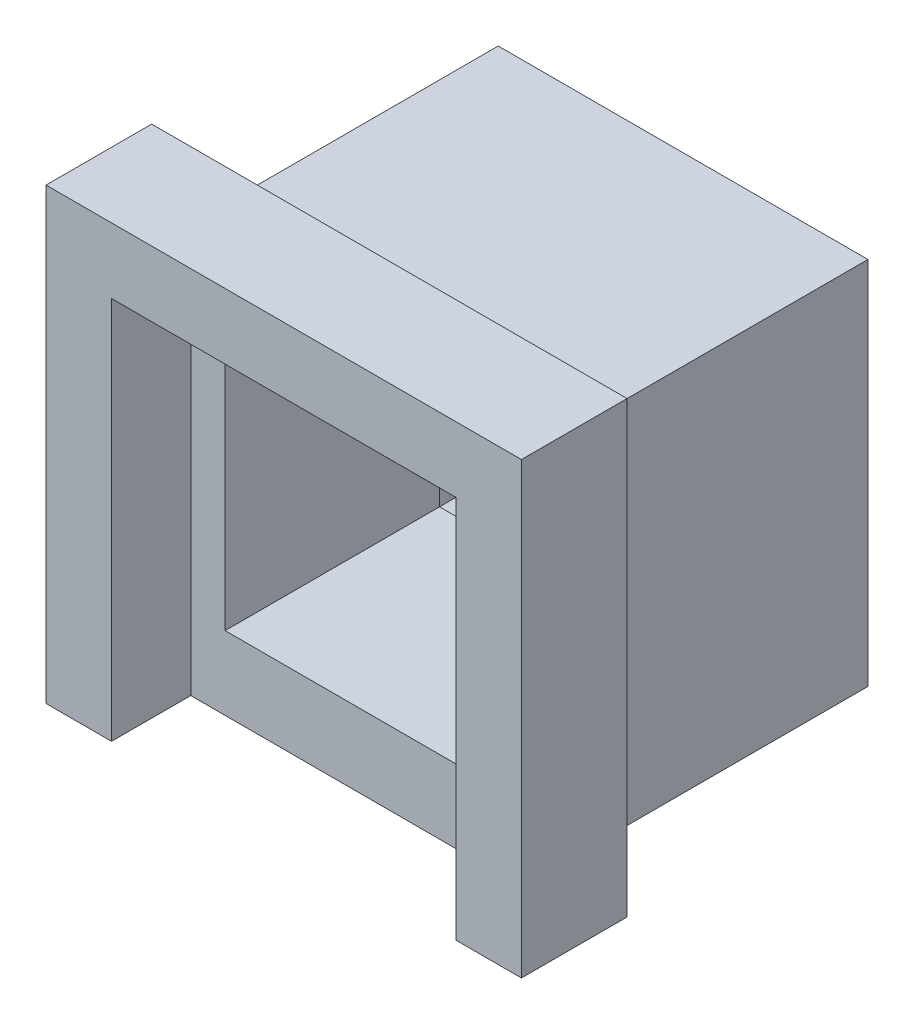
ISO-10303-21;
HEADER;
FILE_DESCRIPTION(('STEP AP214'),'2;1');
FILE_NAME('part.step','',(''),(''),'','','');
FILE_SCHEMA(('AUTOMOTIVE_DESIGN { 1 0 10303 214 1 1 1 1 }'));
ENDSEC;
DATA;
#1=APPLICATION_CONTEXT('core data for automotive mechanical design processes');
#2=APPLICATION_PROTOCOL_DEFINITION('international standard','automotive_design',2000,#1);
#3=PRODUCT_CONTEXT('',#1,'mechanical');
#4=PRODUCT('Part','Part','',(#3));
#5=PRODUCT_RELATED_PRODUCT_CATEGORY('part','',(#4));
#6=PRODUCT_DEFINITION_FORMATION('','',#4);
#7=PRODUCT_DEFINITION_CONTEXT('part definition',#1,'design');
#8=PRODUCT_DEFINITION('design','',#6,#7);
#9=PRODUCT_DEFINITION_SHAPE('','',#8);
#10=(LENGTH_UNIT() NAMED_UNIT(*) SI_UNIT(.MILLI.,.METRE.));
#11=(NAMED_UNIT(*) PLANE_ANGLE_UNIT() SI_UNIT($,.RADIAN.));
#12=(NAMED_UNIT(*) SI_UNIT($,.STERADIAN.) SOLID_ANGLE_UNIT());
#13=UNCERTAINTY_MEASURE_WITH_UNIT(LENGTH_MEASURE(1.E-05),#10,'distance_accuracy_value','');
#14=(GEOMETRIC_REPRESENTATION_CONTEXT(3) GLOBAL_UNCERTAINTY_ASSIGNED_CONTEXT((#13)) GLOBAL_UNIT_ASSIGNED_CONTEXT((#10,
#11,#12)) REPRESENTATION_CONTEXT('',''));
#15=CARTESIAN_POINT('',(0.,0.,0.));
#16=DIRECTION('',(0.,0.,1.));
#17=DIRECTION('',(1.,0.,0.));
#18=AXIS2_PLACEMENT_3D('',#15,#16,#17);
#19=CARTESIAN_POINT('',(-1.305,-1.305,3.78));
#20=DIRECTION('',(1.,0.,0.));
#21=DIRECTION('',(0.,0.,-1.));
#22=AXIS2_PLACEMENT_3D('',#19,#20,#21);
#23=PLANE('',#22);
#24=DIRECTION('',(0.,0.,-1.));
#25=VECTOR('',#24,1.);
#26=CARTESIAN_POINT('',(-1.305,1.305,3.78));
#27=LINE('',#26,#25);
#28=CARTESIAN_POINT('',(-1.305,1.305,3.03));
#29=VERTEX_POINT('',#28);
#30=CARTESIAN_POINT('',(-1.305,1.305,1.));
#31=VERTEX_POINT('',#30);
#32=EDGE_CURVE('E297',#29,#31,#27,.T.);
#33=ORIENTED_EDGE('',*,*,#32,.F.);
#34=DIRECTION('',(0.,-1.,0.));
#35=VECTOR('',#34,1.);
#36=CARTESIAN_POINT('',(-1.305,-1.305,3.03));
#37=LINE('',#36,#35);
#38=CARTESIAN_POINT('',(-1.305,-1.305,3.03));
#39=VERTEX_POINT('',#38);
#40=EDGE_CURVE('E49',#29,#39,#37,.T.);
#41=ORIENTED_EDGE('',*,*,#40,.T.);
#42=DIRECTION('',(0.,0.,-1.));
#43=VECTOR('',#42,1.);
#44=CARTESIAN_POINT('',(-1.305,-1.305,3.78));
#45=LINE('',#44,#43);
#46=CARTESIAN_POINT('',(-1.305,-1.305,1.));
#47=VERTEX_POINT('',#46);
#48=EDGE_CURVE('E303',#39,#47,#45,.T.);
#49=ORIENTED_EDGE('',*,*,#48,.T.);
#50=DIRECTION('',(0.,-1.,0.));
#51=VECTOR('',#50,1.);
#52=CARTESIAN_POINT('',(-1.305,-1.305,1.));
#53=LINE('',#52,#51);
#54=EDGE_CURVE('E260',#31,#47,#53,.T.);
#55=ORIENTED_EDGE('',*,*,#54,.F.);
#56=EDGE_LOOP('',(#33,#41,#49,#55));
#57=FACE_BOUND('',#56,.T.);
#58=ADVANCED_FACE('F34',(#57),#23,.T.);
#59=CARTESIAN_POINT('',(1.305,-1.305,3.78));
#60=DIRECTION('',(0.,1.,0.));
#61=DIRECTION('',(-1.,0.,0.));
#62=AXIS2_PLACEMENT_3D('',#59,#60,#61);
#63=PLANE('',#62);
#64=ORIENTED_EDGE('',*,*,#48,.F.);
#65=DIRECTION('',(1.,0.,0.));
#66=VECTOR('',#65,1.);
#67=CARTESIAN_POINT('',(1.305,-1.305,3.03));
#68=LINE('',#67,#66);
#69=CARTESIAN_POINT('',(1.305,-1.305,3.03));
#70=VERTEX_POINT('',#69);
#71=EDGE_CURVE('E204',#39,#70,#68,.T.);
#72=ORIENTED_EDGE('',*,*,#71,.T.);
#73=DIRECTION('',(0.,0.,-1.));
#74=VECTOR('',#73,1.);
#75=CARTESIAN_POINT('',(1.305,-1.305,3.78));
#76=LINE('',#75,#74);
#77=CARTESIAN_POINT('',(1.305,-1.305,1.));
#78=VERTEX_POINT('',#77);
#79=EDGE_CURVE('E301',#70,#78,#76,.T.);
#80=ORIENTED_EDGE('',*,*,#79,.T.);
#81=DIRECTION('',(1.,0.,0.));
#82=VECTOR('',#81,1.);
#83=CARTESIAN_POINT('',(-1.305,-1.305,1.));
#84=LINE('',#83,#82);
#85=EDGE_CURVE('E263',#47,#78,#84,.T.);
#86=ORIENTED_EDGE('',*,*,#85,.F.);
#87=EDGE_LOOP('',(#64,#72,#80,#86));
#88=FACE_BOUND('',#87,.T.);
#89=ADVANCED_FACE('F360',(#88),#63,.T.);
#90=CARTESIAN_POINT('',(1.305,-1.305,3.78));
#91=DIRECTION('',(-1.,0.,0.));
#92=DIRECTION('',(0.,0.,1.));
#93=AXIS2_PLACEMENT_3D('',#90,#91,#92);
#94=PLANE('',#93);
#95=ORIENTED_EDGE('',*,*,#79,.F.);
#96=DIRECTION('',(0.,1.,0.));
#97=VECTOR('',#96,1.);
#98=CARTESIAN_POINT('',(1.305,-1.305,3.03));
#99=LINE('',#98,#97);
#100=CARTESIAN_POINT('',(1.305,1.305,3.03));
#101=VERTEX_POINT('',#100);
#102=EDGE_CURVE('E201',#70,#101,#99,.T.);
#103=ORIENTED_EDGE('',*,*,#102,.T.);
#104=DIRECTION('',(0.,0.,-1.));
#105=VECTOR('',#104,1.);
#106=CARTESIAN_POINT('',(1.305,1.305,3.78));
#107=LINE('',#106,#105);
#108=CARTESIAN_POINT('',(1.305,1.305,1.));
#109=VERTEX_POINT('',#108);
#110=EDGE_CURVE('E299',#101,#109,#107,.T.);
#111=ORIENTED_EDGE('',*,*,#110,.T.);
#112=DIRECTION('',(0.,1.,0.));
#113=VECTOR('',#112,1.);
#114=CARTESIAN_POINT('',(1.305,-1.305,1.));
#115=LINE('',#114,#113);
#116=EDGE_CURVE('E248',#78,#109,#115,.T.);
#117=ORIENTED_EDGE('',*,*,#116,.F.);
#118=EDGE_LOOP('',(#95,#103,#111,#117));
#119=FACE_BOUND('',#118,.T.);
#120=ADVANCED_FACE('F366',(#119),#94,.T.);
#121=CARTESIAN_POINT('',(1.305,1.305,3.78));
#122=DIRECTION('',(0.,-1.,0.));
#123=DIRECTION('',(1.,0.,0.));
#124=AXIS2_PLACEMENT_3D('',#121,#122,#123);
#125=PLANE('',#124);
#126=ORIENTED_EDGE('',*,*,#110,.F.);
#127=DIRECTION('',(-1.,0.,0.));
#128=VECTOR('',#127,1.);
#129=CARTESIAN_POINT('',(1.305,1.305,3.03));
#130=LINE('',#129,#128);
#131=EDGE_CURVE('E198',#101,#29,#130,.T.);
#132=ORIENTED_EDGE('',*,*,#131,.T.);
#133=ORIENTED_EDGE('',*,*,#32,.T.);
#134=DIRECTION('',(-1.,0.,0.));
#135=VECTOR('',#134,1.);
#136=CARTESIAN_POINT('',(-1.305,1.305,1.));
#137=LINE('',#136,#135);
#138=EDGE_CURVE('E257',#109,#31,#137,.T.);
#139=ORIENTED_EDGE('',*,*,#138,.F.);
#140=EDGE_LOOP('',(#126,#132,#133,#139));
#141=FACE_BOUND('',#140,.T.);
#142=ADVANCED_FACE('F392',(#141),#125,.T.);
#143=CARTESIAN_POINT('',(-1.75,-1.75,3.78));
#144=DIRECTION('',(1.,0.,0.));
#145=DIRECTION('',(0.,0.,-1.));
#146=AXIS2_PLACEMENT_3D('',#143,#144,#145);
#147=PLANE('',#146);
#148=DIRECTION('',(0.,-1.,0.));
#149=VECTOR('',#148,1.);
#150=CARTESIAN_POINT('',(-1.75,1.75,2.78));
#151=LINE('',#150,#149);
#152=CARTESIAN_POINT('',(-1.75,1.75,2.78));
#153=VERTEX_POINT('',#152);
#154=CARTESIAN_POINT('',(-1.75,-1.75,2.78));
#155=VERTEX_POINT('',#154);
#156=EDGE_CURVE('E214',#153,#155,#151,.T.);
#157=ORIENTED_EDGE('',*,*,#156,.F.);
#158=DIRECTION('',(0.,0.,-1.));
#159=VECTOR('',#158,1.);
#160=CARTESIAN_POINT('',(-1.75,1.75,3.78));
#161=LINE('',#160,#159);
#162=CARTESIAN_POINT('',(-1.75,1.75,0.));
#163=VERTEX_POINT('',#162);
#164=EDGE_CURVE('E317',#153,#163,#161,.T.);
#165=ORIENTED_EDGE('',*,*,#164,.T.);
#166=DIRECTION('',(0.,-1.,0.));
#167=VECTOR('',#166,1.);
#168=CARTESIAN_POINT('',(-1.75,-1.75,0.));
#169=LINE('',#168,#167);
#170=CARTESIAN_POINT('',(-1.75,-1.75,0.));
#171=VERTEX_POINT('',#170);
#172=EDGE_CURVE('E305',#163,#171,#169,.T.);
#173=ORIENTED_EDGE('',*,*,#172,.T.);
#174=DIRECTION('',(0.,0.,-1.));
#175=VECTOR('',#174,1.);
#176=CARTESIAN_POINT('',(-1.75,-1.75,3.78));
#177=LINE('',#176,#175);
#178=EDGE_CURVE('E323',#155,#171,#177,.T.);
#179=ORIENTED_EDGE('',*,*,#178,.F.);
#180=EDGE_LOOP('',(#157,#165,#173,#179));
#181=FACE_BOUND('',#180,.T.);
#182=ADVANCED_FACE('F36',(#181),#147,.F.);
#183=CARTESIAN_POINT('',(1.75,-1.75,3.78));
#184=DIRECTION('',(0.,1.,0.));
#185=DIRECTION('',(-1.,0.,0.));
#186=AXIS2_PLACEMENT_3D('',#183,#184,#185);
#187=PLANE('',#186);
#188=DIRECTION('',(1.,0.,0.));
#189=VECTOR('',#188,1.);
#190=CARTESIAN_POINT('',(-1.75,-1.75,2.78));
#191=LINE('',#190,#189);
#192=CARTESIAN_POINT('',(1.75,-1.75,2.78));
#193=VERTEX_POINT('',#192);
#194=EDGE_CURVE('E217',#155,#193,#191,.T.);
#195=ORIENTED_EDGE('',*,*,#194,.F.);
#196=ORIENTED_EDGE('',*,*,#178,.T.);
#197=DIRECTION('',(1.,0.,0.));
#198=VECTOR('',#197,1.);
#199=CARTESIAN_POINT('',(1.75,-1.75,0.));
#200=LINE('',#199,#198);
#201=CARTESIAN_POINT('',(1.75,-1.75,0.));
#202=VERTEX_POINT('',#201);
#203=EDGE_CURVE('E308',#171,#202,#200,.T.);
#204=ORIENTED_EDGE('',*,*,#203,.T.);
#205=DIRECTION('',(0.,0.,-1.));
#206=VECTOR('',#205,1.);
#207=CARTESIAN_POINT('',(1.75,-1.75,3.78));
#208=LINE('',#207,#206);
#209=EDGE_CURVE('E321',#193,#202,#208,.T.);
#210=ORIENTED_EDGE('',*,*,#209,.F.);
#211=EDGE_LOOP('',(#195,#196,#204,#210));
#212=FACE_BOUND('',#211,.T.);
#213=ADVANCED_FACE('F385',(#212),#187,.F.);
#214=CARTESIAN_POINT('',(1.75,-1.75,3.78));
#215=DIRECTION('',(-1.,0.,0.));
#216=DIRECTION('',(0.,0.,1.));
#217=AXIS2_PLACEMENT_3D('',#214,#215,#216);
#218=PLANE('',#217);
#219=DIRECTION('',(0.,1.,0.));
#220=VECTOR('',#219,1.);
#221=CARTESIAN_POINT('',(1.75,-1.75,2.78));
#222=LINE('',#221,#220);
#223=CARTESIAN_POINT('',(1.75,1.75,2.78));
#224=VERTEX_POINT('',#223);
#225=EDGE_CURVE('E208',#193,#224,#222,.T.);
#226=ORIENTED_EDGE('',*,*,#225,.F.);
#227=ORIENTED_EDGE('',*,*,#209,.T.);
#228=DIRECTION('',(0.,1.,0.));
#229=VECTOR('',#228,1.);
#230=CARTESIAN_POINT('',(1.75,-1.75,0.));
#231=LINE('',#230,#229);
#232=CARTESIAN_POINT('',(1.75,1.75,0.));
#233=VERTEX_POINT('',#232);
#234=EDGE_CURVE('E311',#202,#233,#231,.T.);
#235=ORIENTED_EDGE('',*,*,#234,.T.);
#236=DIRECTION('',(0.,0.,-1.));
#237=VECTOR('',#236,1.);
#238=CARTESIAN_POINT('',(1.75,1.75,3.78));
#239=LINE('',#238,#237);
#240=EDGE_CURVE('E319',#224,#233,#239,.T.);
#241=ORIENTED_EDGE('',*,*,#240,.F.);
#242=EDGE_LOOP('',(#226,#227,#235,#241));
#243=FACE_BOUND('',#242,.T.);
#244=ADVANCED_FACE('F382',(#243),#218,.F.);
#245=CARTESIAN_POINT('',(1.75,1.75,3.78));
#246=DIRECTION('',(0.,-1.,0.));
#247=DIRECTION('',(1.,0.,0.));
#248=AXIS2_PLACEMENT_3D('',#245,#246,#247);
#249=PLANE('',#248);
#250=DIRECTION('',(-1.,0.,0.));
#251=VECTOR('',#250,1.);
#252=CARTESIAN_POINT('',(1.75,1.75,2.78));
#253=LINE('',#252,#251);
#254=EDGE_CURVE('E211',#224,#153,#253,.T.);
#255=ORIENTED_EDGE('',*,*,#254,.F.);
#256=ORIENTED_EDGE('',*,*,#240,.T.);
#257=DIRECTION('',(-1.,0.,0.));
#258=VECTOR('',#257,1.);
#259=CARTESIAN_POINT('',(1.75,1.75,0.));
#260=LINE('',#259,#258);
#261=EDGE_CURVE('E314',#233,#163,#260,.T.);
#262=ORIENTED_EDGE('',*,*,#261,.T.);
#263=ORIENTED_EDGE('',*,*,#164,.F.);
#264=EDGE_LOOP('',(#255,#256,#262,#263));
#265=FACE_BOUND('',#264,.T.);
#266=ADVANCED_FACE('F378',(#265),#249,.F.);
#267=CARTESIAN_POINT('',(0.,0.,0.));
#268=DIRECTION('',(0.,0.,1.));
#269=DIRECTION('',(1.,0.,0.));
#270=AXIS2_PLACEMENT_3D('',#267,#268,#269);
#271=PLANE('',#270);
#272=ORIENTED_EDGE('',*,*,#172,.F.);
#273=ORIENTED_EDGE('',*,*,#261,.F.);
#274=ORIENTED_EDGE('',*,*,#234,.F.);
#275=ORIENTED_EDGE('',*,*,#203,.F.);
#276=EDGE_LOOP('',(#272,#273,#274,#275));
#277=FACE_BOUND('',#276,.T.);
#278=DIRECTION('',(0.,1.,0.));
#279=VECTOR('',#278,1.);
#280=CARTESIAN_POINT('',(1.55,-1.55,0.));
#281=LINE('',#280,#279);
#282=CARTESIAN_POINT('',(1.55,-1.55,0.));
#283=VERTEX_POINT('',#282);
#284=CARTESIAN_POINT('',(1.55,1.55,0.));
#285=VERTEX_POINT('',#284);
#286=EDGE_CURVE('E266',#283,#285,#281,.T.);
#287=ORIENTED_EDGE('',*,*,#286,.T.);
#288=DIRECTION('',(-1.,0.,0.));
#289=VECTOR('',#288,1.);
#290=CARTESIAN_POINT('',(-1.55,1.55,0.));
#291=LINE('',#290,#289);
#292=CARTESIAN_POINT('',(-1.55,1.55,0.));
#293=VERTEX_POINT('',#292);
#294=EDGE_CURVE('E280',#285,#293,#291,.T.);
#295=ORIENTED_EDGE('',*,*,#294,.T.);
#296=DIRECTION('',(0.,-1.,0.));
#297=VECTOR('',#296,1.);
#298=CARTESIAN_POINT('',(-1.55,-1.55,0.));
#299=LINE('',#298,#297);
#300=CARTESIAN_POINT('',(-1.55,-1.55,0.));
#301=VERTEX_POINT('',#300);
#302=EDGE_CURVE('E283',#293,#301,#299,.T.);
#303=ORIENTED_EDGE('',*,*,#302,.T.);
#304=DIRECTION('',(1.,0.,0.));
#305=VECTOR('',#304,1.);
#306=CARTESIAN_POINT('',(-1.55,-1.55,0.));
#307=LINE('',#306,#305);
#308=EDGE_CURVE('E271',#301,#283,#307,.T.);
#309=ORIENTED_EDGE('',*,*,#308,.T.);
#310=EDGE_LOOP('',(#287,#295,#303,#309));
#311=FACE_BOUND('',#310,.T.);
#312=ADVANCED_FACE('F375',(#277,#311),#271,.F.);
#313=CARTESIAN_POINT('',(0.,0.,3.78));
#314=DIRECTION('',(0.,0.,1.));
#315=DIRECTION('',(1.,0.,0.));
#316=AXIS2_PLACEMENT_3D('',#313,#314,#315);
#317=PLANE('',#316);
#318=DIRECTION('',(0.,-1.,0.));
#319=VECTOR('',#318,1.);
#320=CARTESIAN_POINT('',(-1.63,1.63,3.78));
#321=LINE('',#320,#319);
#322=CARTESIAN_POINT('',(-1.63,1.63,3.78));
#323=VERTEX_POINT('',#322);
#324=CARTESIAN_POINT('',(-1.63,-2.,3.78));
#325=VERTEX_POINT('',#324);
#326=EDGE_CURVE('E193',#323,#325,#321,.T.);
#327=ORIENTED_EDGE('',*,*,#326,.F.);
#328=DIRECTION('',(-1.,0.,0.));
#329=VECTOR('',#328,1.);
#330=CARTESIAN_POINT('',(-1.63,1.63,3.78));
#331=LINE('',#330,#329);
#332=CARTESIAN_POINT('',(1.63,1.63,3.78));
#333=VERTEX_POINT('',#332);
#334=EDGE_CURVE('E196',#333,#323,#331,.T.);
#335=ORIENTED_EDGE('',*,*,#334,.F.);
#336=DIRECTION('',(0.,1.,0.));
#337=VECTOR('',#336,1.);
#338=CARTESIAN_POINT('',(1.63,1.63,3.78));
#339=LINE('',#338,#337);
#340=CARTESIAN_POINT('',(1.63,-2.,3.78));
#341=VERTEX_POINT('',#340);
#342=EDGE_CURVE('E183',#341,#333,#339,.T.);
#343=ORIENTED_EDGE('',*,*,#342,.F.);
#344=DIRECTION('',(1.,0.,0.));
#345=VECTOR('',#344,1.);
#346=CARTESIAN_POINT('',(-2.25,-2.,3.78));
#347=LINE('',#346,#345);
#348=CARTESIAN_POINT('',(2.25,-2.,3.78));
#349=VERTEX_POINT('',#348);
#350=EDGE_CURVE('E237',#341,#349,#347,.T.);
#351=ORIENTED_EDGE('',*,*,#350,.T.);
#352=DIRECTION('',(0.,1.,0.));
#353=VECTOR('',#352,1.);
#354=CARTESIAN_POINT('',(2.25,-2.,3.78));
#355=LINE('',#354,#353);
#356=CARTESIAN_POINT('',(2.25,2.25,3.78));
#357=VERTEX_POINT('',#356);
#358=EDGE_CURVE('E241',#349,#357,#355,.T.);
#359=ORIENTED_EDGE('',*,*,#358,.T.);
#360=DIRECTION('',(-1.,0.,0.));
#361=VECTOR('',#360,1.);
#362=CARTESIAN_POINT('',(-2.25,2.25,3.78));
#363=LINE('',#362,#361);
#364=CARTESIAN_POINT('',(-2.25,2.25,3.78));
#365=VERTEX_POINT('',#364);
#366=EDGE_CURVE('E225',#357,#365,#363,.T.);
#367=ORIENTED_EDGE('',*,*,#366,.T.);
#368=DIRECTION('',(0.,-1.,0.));
#369=VECTOR('',#368,1.);
#370=CARTESIAN_POINT('',(-2.25,2.25,3.78));
#371=LINE('',#370,#369);
#372=CARTESIAN_POINT('',(-2.25,-2.,3.78));
#373=VERTEX_POINT('',#372);
#374=EDGE_CURVE('E220',#365,#373,#371,.T.);
#375=ORIENTED_EDGE('',*,*,#374,.T.);
#376=EDGE_CURVE('E238',#373,#325,#347,.T.);
#377=ORIENTED_EDGE('',*,*,#376,.T.);
#378=EDGE_LOOP('',(#327,#335,#343,#351,#359,#367,#375,#377));
#379=FACE_BOUND('',#378,.T.);
#380=ADVANCED_FACE('F329',(#379),#317,.T.);
#381=CARTESIAN_POINT('',(0.,0.,1.));
#382=DIRECTION('',(0.,0.,-1.));
#383=DIRECTION('',(-1.,0.,0.));
#384=AXIS2_PLACEMENT_3D('',#381,#382,#383);
#385=PLANE('',#384);
#386=DIRECTION('',(0.,1.,0.));
#387=VECTOR('',#386,1.);
#388=CARTESIAN_POINT('',(1.55,-1.55,1.));
#389=LINE('',#388,#387);
#390=CARTESIAN_POINT('',(1.55,-1.55,1.));
#391=VERTEX_POINT('',#390);
#392=CARTESIAN_POINT('',(1.55,1.55,1.));
#393=VERTEX_POINT('',#392);
#394=EDGE_CURVE('E267',#391,#393,#389,.T.);
#395=ORIENTED_EDGE('',*,*,#394,.F.);
#396=DIRECTION('',(1.,0.,0.));
#397=VECTOR('',#396,1.);
#398=CARTESIAN_POINT('',(-1.55,-1.55,1.));
#399=LINE('',#398,#397);
#400=CARTESIAN_POINT('',(-1.55,-1.55,1.));
#401=VERTEX_POINT('',#400);
#402=EDGE_CURVE('E275',#401,#391,#399,.T.);
#403=ORIENTED_EDGE('',*,*,#402,.F.);
#404=DIRECTION('',(0.,-1.,0.));
#405=VECTOR('',#404,1.);
#406=CARTESIAN_POINT('',(-1.55,-1.55,1.));
#407=LINE('',#406,#405);
#408=CARTESIAN_POINT('',(-1.55,1.55,1.));
#409=VERTEX_POINT('',#408);
#410=EDGE_CURVE('E273',#409,#401,#407,.T.);
#411=ORIENTED_EDGE('',*,*,#410,.F.);
#412=DIRECTION('',(-1.,0.,0.));
#413=VECTOR('',#412,1.);
#414=CARTESIAN_POINT('',(-1.55,1.55,1.));
#415=LINE('',#414,#413);
#416=EDGE_CURVE('E270',#393,#409,#415,.T.);
#417=ORIENTED_EDGE('',*,*,#416,.F.);
#418=EDGE_LOOP('',(#395,#403,#411,#417));
#419=FACE_BOUND('',#418,.T.);
#420=ORIENTED_EDGE('',*,*,#116,.T.);
#421=ORIENTED_EDGE('',*,*,#138,.T.);
#422=ORIENTED_EDGE('',*,*,#54,.T.);
#423=ORIENTED_EDGE('',*,*,#85,.T.);
#424=EDGE_LOOP('',(#420,#421,#422,#423));
#425=FACE_BOUND('',#424,.T.);
#426=ADVANCED_FACE('F374',(#419,#425),#385,.T.);
#427=CARTESIAN_POINT('',(1.55,-1.55,1.));
#428=DIRECTION('',(-1.,0.,0.));
#429=DIRECTION('',(0.,0.,1.));
#430=AXIS2_PLACEMENT_3D('',#427,#428,#429);
#431=PLANE('',#430);
#432=ORIENTED_EDGE('',*,*,#286,.F.);
#433=DIRECTION('',(0.,0.,-1.));
#434=VECTOR('',#433,1.);
#435=CARTESIAN_POINT('',(1.55,-1.55,1.));
#436=LINE('',#435,#434);
#437=EDGE_CURVE('E277',#391,#283,#436,.T.);
#438=ORIENTED_EDGE('',*,*,#437,.F.);
#439=ORIENTED_EDGE('',*,*,#394,.T.);
#440=DIRECTION('',(0.,0.,-1.));
#441=VECTOR('',#440,1.);
#442=CARTESIAN_POINT('',(1.55,1.55,1.));
#443=LINE('',#442,#441);
#444=EDGE_CURVE('E294',#393,#285,#443,.T.);
#445=ORIENTED_EDGE('',*,*,#444,.T.);
#446=EDGE_LOOP('',(#432,#438,#439,#445));
#447=FACE_BOUND('',#446,.T.);
#448=ADVANCED_FACE('F407',(#447),#431,.T.);
#449=CARTESIAN_POINT('',(-1.55,1.55,1.));
#450=DIRECTION('',(0.,-1.,0.));
#451=DIRECTION('',(0.,0.,-1.));
#452=AXIS2_PLACEMENT_3D('',#449,#450,#451);
#453=PLANE('',#452);
#454=ORIENTED_EDGE('',*,*,#294,.F.);
#455=ORIENTED_EDGE('',*,*,#444,.F.);
#456=ORIENTED_EDGE('',*,*,#416,.T.);
#457=DIRECTION('',(0.,0.,-1.));
#458=VECTOR('',#457,1.);
#459=CARTESIAN_POINT('',(-1.55,1.55,1.));
#460=LINE('',#459,#458);
#461=EDGE_CURVE('E292',#409,#293,#460,.T.);
#462=ORIENTED_EDGE('',*,*,#461,.T.);
#463=EDGE_LOOP('',(#454,#455,#456,#462));
#464=FACE_BOUND('',#463,.T.);
#465=ADVANCED_FACE('F418',(#464),#453,.T.);
#466=CARTESIAN_POINT('',(-1.55,-1.55,1.));
#467=DIRECTION('',(1.,0.,0.));
#468=DIRECTION('',(0.,0.,-1.));
#469=AXIS2_PLACEMENT_3D('',#466,#467,#468);
#470=PLANE('',#469);
#471=ORIENTED_EDGE('',*,*,#302,.F.);
#472=ORIENTED_EDGE('',*,*,#461,.F.);
#473=ORIENTED_EDGE('',*,*,#410,.T.);
#474=DIRECTION('',(0.,0.,-1.));
#475=VECTOR('',#474,1.);
#476=CARTESIAN_POINT('',(-1.55,-1.55,1.));
#477=LINE('',#476,#475);
#478=EDGE_CURVE('E290',#401,#301,#477,.T.);
#479=ORIENTED_EDGE('',*,*,#478,.T.);
#480=EDGE_LOOP('',(#471,#472,#473,#479));
#481=FACE_BOUND('',#480,.T.);
#482=ADVANCED_FACE('F422',(#481),#470,.T.);
#483=CARTESIAN_POINT('',(-1.55,-1.55,1.));
#484=DIRECTION('',(0.,1.,0.));
#485=DIRECTION('',(0.,0.,1.));
#486=AXIS2_PLACEMENT_3D('',#483,#484,#485);
#487=PLANE('',#486);
#488=ORIENTED_EDGE('',*,*,#308,.F.);
#489=ORIENTED_EDGE('',*,*,#478,.F.);
#490=ORIENTED_EDGE('',*,*,#402,.T.);
#491=ORIENTED_EDGE('',*,*,#437,.T.);
#492=EDGE_LOOP('',(#488,#489,#490,#491));
#493=FACE_BOUND('',#492,.T.);
#494=ADVANCED_FACE('F411',(#493),#487,.T.);
#495=CARTESIAN_POINT('',(-2.25,2.25,2.78));
#496=DIRECTION('',(-1.,0.,0.));
#497=DIRECTION('',(0.,0.,1.));
#498=AXIS2_PLACEMENT_3D('',#495,#496,#497);
#499=PLANE('',#498);
#500=ORIENTED_EDGE('',*,*,#374,.F.);
#501=DIRECTION('',(0.,0.,1.));
#502=VECTOR('',#501,1.);
#503=CARTESIAN_POINT('',(-2.25,2.25,2.78));
#504=LINE('',#503,#502);
#505=CARTESIAN_POINT('',(-2.25,2.25,2.78));
#506=VERTEX_POINT('',#505);
#507=EDGE_CURVE('E246',#506,#365,#504,.T.);
#508=ORIENTED_EDGE('',*,*,#507,.F.);
#509=DIRECTION('',(0.,-1.,0.));
#510=VECTOR('',#509,1.);
#511=CARTESIAN_POINT('',(-2.25,2.25,2.78));
#512=LINE('',#511,#510);
#513=CARTESIAN_POINT('',(-2.25,-2.,2.78));
#514=VERTEX_POINT('',#513);
#515=EDGE_CURVE('E221',#506,#514,#512,.T.);
#516=ORIENTED_EDGE('',*,*,#515,.T.);
#517=DIRECTION('',(0.,0.,1.));
#518=VECTOR('',#517,1.);
#519=CARTESIAN_POINT('',(-2.25,-2.,2.78));
#520=LINE('',#519,#518);
#521=EDGE_CURVE('E234',#514,#373,#520,.T.);
#522=ORIENTED_EDGE('',*,*,#521,.T.);
#523=EDGE_LOOP('',(#500,#508,#516,#522));
#524=FACE_BOUND('',#523,.T.);
#525=ADVANCED_FACE('F344',(#524),#499,.T.);
#526=CARTESIAN_POINT('',(-2.25,2.25,2.78));
#527=DIRECTION('',(0.,1.,0.));
#528=DIRECTION('',(-1.,0.,0.));
#529=AXIS2_PLACEMENT_3D('',#526,#527,#528);
#530=PLANE('',#529);
#531=ORIENTED_EDGE('',*,*,#366,.F.);
#532=DIRECTION('',(0.,0.,1.));
#533=VECTOR('',#532,1.);
#534=CARTESIAN_POINT('',(2.25,2.25,2.78));
#535=LINE('',#534,#533);
#536=CARTESIAN_POINT('',(2.25,2.25,2.78));
#537=VERTEX_POINT('',#536);
#538=EDGE_CURVE('E249',#537,#357,#535,.T.);
#539=ORIENTED_EDGE('',*,*,#538,.F.);
#540=DIRECTION('',(-1.,0.,0.));
#541=VECTOR('',#540,1.);
#542=CARTESIAN_POINT('',(-2.25,2.25,2.78));
#543=LINE('',#542,#541);
#544=EDGE_CURVE('E231',#537,#506,#543,.T.);
#545=ORIENTED_EDGE('',*,*,#544,.T.);
#546=ORIENTED_EDGE('',*,*,#507,.T.);
#547=EDGE_LOOP('',(#531,#539,#545,#546));
#548=FACE_BOUND('',#547,.T.);
#549=ADVANCED_FACE('F339',(#548),#530,.T.);
#550=CARTESIAN_POINT('',(2.25,-2.,2.78));
#551=DIRECTION('',(1.,0.,0.));
#552=DIRECTION('',(0.,0.,-1.));
#553=AXIS2_PLACEMENT_3D('',#550,#551,#552);
#554=PLANE('',#553);
#555=ORIENTED_EDGE('',*,*,#358,.F.);
#556=DIRECTION('',(0.,0.,1.));
#557=VECTOR('',#556,1.);
#558=CARTESIAN_POINT('',(2.25,-2.,2.78));
#559=LINE('',#558,#557);
#560=CARTESIAN_POINT('',(2.25,-2.,2.78));
#561=VERTEX_POINT('',#560);
#562=EDGE_CURVE('E251',#561,#349,#559,.T.);
#563=ORIENTED_EDGE('',*,*,#562,.F.);
#564=DIRECTION('',(0.,1.,0.));
#565=VECTOR('',#564,1.);
#566=CARTESIAN_POINT('',(2.25,-2.,2.78));
#567=LINE('',#566,#565);
#568=EDGE_CURVE('E228',#561,#537,#567,.T.);
#569=ORIENTED_EDGE('',*,*,#568,.T.);
#570=ORIENTED_EDGE('',*,*,#538,.T.);
#571=EDGE_LOOP('',(#555,#563,#569,#570));
#572=FACE_BOUND('',#571,.T.);
#573=ADVANCED_FACE('F336',(#572),#554,.T.);
#574=CARTESIAN_POINT('',(-2.25,-2.,2.78));
#575=DIRECTION('',(0.,-1.,0.));
#576=DIRECTION('',(0.,0.,-1.));
#577=AXIS2_PLACEMENT_3D('',#574,#575,#576);
#578=PLANE('',#577);
#579=DIRECTION('',(0.,0.,-1.));
#580=VECTOR('',#579,1.);
#581=CARTESIAN_POINT('',(-1.63,-2.,2.78));
#582=LINE('',#581,#580);
#583=CARTESIAN_POINT('',(-1.63,-2.,3.03));
#584=VERTEX_POINT('',#583);
#585=EDGE_CURVE('E11',#325,#584,#582,.T.);
#586=ORIENTED_EDGE('',*,*,#585,.F.);
#587=ORIENTED_EDGE('',*,*,#376,.F.);
#588=ORIENTED_EDGE('',*,*,#521,.F.);
#589=DIRECTION('',(1.,0.,0.));
#590=VECTOR('',#589,1.);
#591=CARTESIAN_POINT('',(-2.25,-2.,2.78));
#592=LINE('',#591,#590);
#593=EDGE_CURVE('E224',#514,#561,#592,.T.);
#594=ORIENTED_EDGE('',*,*,#593,.T.);
#595=ORIENTED_EDGE('',*,*,#562,.T.);
#596=ORIENTED_EDGE('',*,*,#350,.F.);
#597=DIRECTION('',(0.,0.,1.));
#598=VECTOR('',#597,1.);
#599=CARTESIAN_POINT('',(1.63,-2.,2.78));
#600=LINE('',#599,#598);
#601=CARTESIAN_POINT('',(1.63,-2.,3.03));
#602=VERTEX_POINT('',#601);
#603=EDGE_CURVE('E42',#602,#341,#600,.T.);
#604=ORIENTED_EDGE('',*,*,#603,.F.);
#605=DIRECTION('',(-1.,0.,0.));
#606=VECTOR('',#605,1.);
#607=CARTESIAN_POINT('',(-2.25,-2.,3.03));
#608=LINE('',#607,#606);
#609=EDGE_CURVE('E175',#602,#584,#608,.T.);
#610=ORIENTED_EDGE('',*,*,#609,.T.);
#611=EDGE_LOOP('',(#586,#587,#588,#594,#595,#596,#604,#610));
#612=FACE_BOUND('',#611,.T.);
#613=ADVANCED_FACE('F331',(#612),#578,.T.);
#614=CARTESIAN_POINT('',(0.,0.,2.78));
#615=DIRECTION('',(0.,0.,1.));
#616=DIRECTION('',(1.,0.,0.));
#617=AXIS2_PLACEMENT_3D('',#614,#615,#616);
#618=PLANE('',#617);
#619=ORIENTED_EDGE('',*,*,#194,.T.);
#620=ORIENTED_EDGE('',*,*,#225,.T.);
#621=ORIENTED_EDGE('',*,*,#254,.T.);
#622=ORIENTED_EDGE('',*,*,#156,.T.);
#623=EDGE_LOOP('',(#619,#620,#621,#622));
#624=FACE_BOUND('',#623,.T.);
#625=ORIENTED_EDGE('',*,*,#515,.F.);
#626=ORIENTED_EDGE('',*,*,#544,.F.);
#627=ORIENTED_EDGE('',*,*,#568,.F.);
#628=ORIENTED_EDGE('',*,*,#593,.F.);
#629=EDGE_LOOP('',(#625,#626,#627,#628));
#630=FACE_BOUND('',#629,.T.);
#631=ADVANCED_FACE('F349',(#624,#630),#618,.F.);
#632=CARTESIAN_POINT('',(-1.63,1.63,3.03));
#633=DIRECTION('',(-1.,0.,0.));
#634=DIRECTION('',(0.,-1.,0.));
#635=AXIS2_PLACEMENT_3D('',#632,#633,#634);
#636=PLANE('',#635);
#637=ORIENTED_EDGE('',*,*,#585,.T.);
#638=DIRECTION('',(0.,-1.,0.));
#639=VECTOR('',#638,1.);
#640=CARTESIAN_POINT('',(-1.63,1.63,3.03));
#641=LINE('',#640,#639);
#642=CARTESIAN_POINT('',(-1.63,1.63,3.03));
#643=VERTEX_POINT('',#642);
#644=EDGE_CURVE('E57',#643,#584,#641,.T.);
#645=ORIENTED_EDGE('',*,*,#644,.F.);
#646=DIRECTION('',(0.,0.,1.));
#647=VECTOR('',#646,1.);
#648=CARTESIAN_POINT('',(-1.63,1.63,3.03));
#649=LINE('',#648,#647);
#650=EDGE_CURVE('E187',#643,#323,#649,.T.);
#651=ORIENTED_EDGE('',*,*,#650,.T.);
#652=ORIENTED_EDGE('',*,*,#326,.T.);
#653=EDGE_LOOP('',(#637,#645,#651,#652));
#654=FACE_BOUND('',#653,.T.);
#655=ADVANCED_FACE('F347',(#654),#636,.F.);
#656=CARTESIAN_POINT('',(-1.63,1.63,3.03));
#657=DIRECTION('',(0.,1.,0.));
#658=DIRECTION('',(0.,0.,1.));
#659=AXIS2_PLACEMENT_3D('',#656,#657,#658);
#660=PLANE('',#659);
#661=ORIENTED_EDGE('',*,*,#334,.T.);
#662=ORIENTED_EDGE('',*,*,#650,.F.);
#663=DIRECTION('',(-1.,0.,0.));
#664=VECTOR('',#663,1.);
#665=CARTESIAN_POINT('',(-1.63,1.63,3.03));
#666=LINE('',#665,#664);
#667=CARTESIAN_POINT('',(1.63,1.63,3.03));
#668=VERTEX_POINT('',#667);
#669=EDGE_CURVE('E173',#668,#643,#666,.T.);
#670=ORIENTED_EDGE('',*,*,#669,.F.);
#671=DIRECTION('',(0.,0.,1.));
#672=VECTOR('',#671,1.);
#673=CARTESIAN_POINT('',(1.63,1.63,3.03));
#674=LINE('',#673,#672);
#675=EDGE_CURVE('E180',#668,#333,#674,.T.);
#676=ORIENTED_EDGE('',*,*,#675,.T.);
#677=EDGE_LOOP('',(#661,#662,#670,#676));
#678=FACE_BOUND('',#677,.T.);
#679=ADVANCED_FACE('F189',(#678),#660,.F.);
#680=CARTESIAN_POINT('',(1.63,1.63,3.03));
#681=DIRECTION('',(1.,0.,0.));
#682=DIRECTION('',(0.,1.,0.));
#683=AXIS2_PLACEMENT_3D('',#680,#681,#682);
#684=PLANE('',#683);
#685=ORIENTED_EDGE('',*,*,#603,.T.);
#686=ORIENTED_EDGE('',*,*,#342,.T.);
#687=ORIENTED_EDGE('',*,*,#675,.F.);
#688=DIRECTION('',(0.,1.,0.));
#689=VECTOR('',#688,1.);
#690=CARTESIAN_POINT('',(1.63,1.63,3.03));
#691=LINE('',#690,#689);
#692=EDGE_CURVE('E169',#602,#668,#691,.T.);
#693=ORIENTED_EDGE('',*,*,#692,.F.);
#694=EDGE_LOOP('',(#685,#686,#687,#693));
#695=FACE_BOUND('',#694,.T.);
#696=ADVANCED_FACE('F181',(#695),#684,.F.);
#697=CARTESIAN_POINT('',(0.,0.,3.03));
#698=DIRECTION('',(0.,0.,1.));
#699=DIRECTION('',(1.,0.,0.));
#700=AXIS2_PLACEMENT_3D('',#697,#698,#699);
#701=PLANE('',#700);
#702=ORIENTED_EDGE('',*,*,#131,.F.);
#703=ORIENTED_EDGE('',*,*,#102,.F.);
#704=ORIENTED_EDGE('',*,*,#71,.F.);
#705=ORIENTED_EDGE('',*,*,#40,.F.);
#706=EDGE_LOOP('',(#702,#703,#704,#705));
#707=FACE_BOUND('',#706,.T.);
#708=ORIENTED_EDGE('',*,*,#692,.T.);
#709=ORIENTED_EDGE('',*,*,#669,.T.);
#710=ORIENTED_EDGE('',*,*,#644,.T.);
#711=ORIENTED_EDGE('',*,*,#609,.F.);
#712=EDGE_LOOP('',(#708,#709,#710,#711));
#713=FACE_BOUND('',#712,.T.);
#714=ADVANCED_FACE('F171',(#707,#713),#701,.T.);
#715=CLOSED_SHELL('',(#58,#89,#120,#142,#182,#213,#244,#266,#312,#380,#426,#448,#465,#482,#494,
#525,#549,#573,#613,#631,#655,#679,#696,#714));
#716=MANIFOLD_SOLID_BREP('B2',#715);
#717=ADVANCED_BREP_SHAPE_REPRESENTATION('',(#18,#716),#14);
#718=SHAPE_DEFINITION_REPRESENTATION(#9,#717);
ENDSEC;
END-ISO-10303-21;
